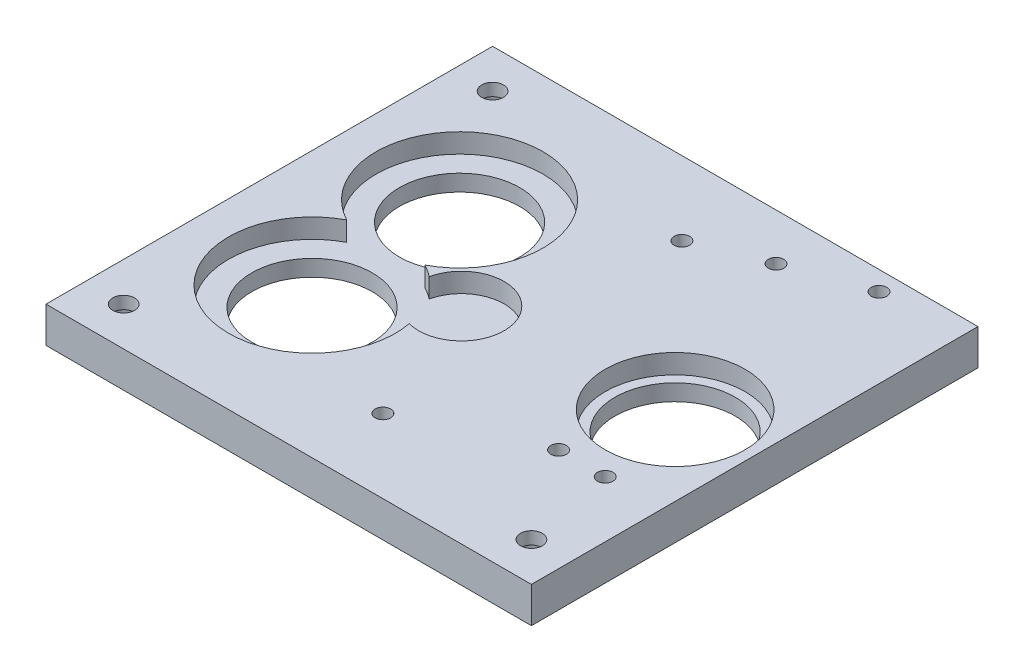
ISO-10303-21;
HEADER;
FILE_DESCRIPTION(('STEP AP214'),'2;1');
FILE_NAME('part.step','',(''),(''),'','','');
FILE_SCHEMA(('AUTOMOTIVE_DESIGN { 1 0 10303 214 1 1 1 1 }'));
ENDSEC;
DATA;
#1=APPLICATION_CONTEXT('core data for automotive mechanical design processes');
#2=APPLICATION_PROTOCOL_DEFINITION('international standard','automotive_design',2000,#1);
#3=PRODUCT_CONTEXT('',#1,'mechanical');
#4=PRODUCT('Part','Part','',(#3));
#5=PRODUCT_RELATED_PRODUCT_CATEGORY('part','',(#4));
#6=PRODUCT_DEFINITION_FORMATION('','',#4);
#7=PRODUCT_DEFINITION_CONTEXT('part definition',#1,'design');
#8=PRODUCT_DEFINITION('design','',#6,#7);
#9=PRODUCT_DEFINITION_SHAPE('','',#8);
#10=(LENGTH_UNIT() NAMED_UNIT(*) SI_UNIT(.MILLI.,.METRE.));
#11=(NAMED_UNIT(*) PLANE_ANGLE_UNIT() SI_UNIT($,.RADIAN.));
#12=(NAMED_UNIT(*) SI_UNIT($,.STERADIAN.) SOLID_ANGLE_UNIT());
#13=UNCERTAINTY_MEASURE_WITH_UNIT(LENGTH_MEASURE(1.E-05),#10,'distance_accuracy_value','');
#14=(GEOMETRIC_REPRESENTATION_CONTEXT(3) GLOBAL_UNCERTAINTY_ASSIGNED_CONTEXT((#13)) GLOBAL_UNIT_ASSIGNED_CONTEXT((#10,
#11,#12)) REPRESENTATION_CONTEXT('',''));
#15=CARTESIAN_POINT('',(0.,0.,0.));
#16=DIRECTION('',(0.,0.,1.));
#17=DIRECTION('',(1.,0.,0.));
#18=AXIS2_PLACEMENT_3D('',#15,#16,#17);
#19=CARTESIAN_POINT('',(52.5,0.,47.5));
#20=DIRECTION('',(0.,1.,0.));
#21=DIRECTION('',(0.,0.,1.));
#22=AXIS2_PLACEMENT_3D('',#19,#20,#21);
#23=CYLINDRICAL_SURFACE('',#22,2.8);
#24=CARTESIAN_POINT('',(52.5,9.215,47.5));
#25=DIRECTION('',(0.,1.,0.));
#26=DIRECTION('',(0.,0.,1.));
#27=AXIS2_PLACEMENT_3D('',#24,#25,#26);
#28=CIRCLE('',#27,2.8);
#29=CARTESIAN_POINT('',(52.5,9.215,50.3));
#30=VERTEX_POINT('',#29);
#31=EDGE_CURVE('E190',#30,#30,#28,.T.);
#32=ORIENTED_EDGE('',*,*,#31,.T.);
#33=EDGE_LOOP('',(#32));
#34=FACE_BOUND('',#33,.T.);
#35=CARTESIAN_POINT('',(52.5,6.,47.5));
#36=DIRECTION('',(0.,-1.,0.));
#37=DIRECTION('',(0.,0.,-1.));
#38=AXIS2_PLACEMENT_3D('',#35,#36,#37);
#39=CIRCLE('',#38,2.8);
#40=CARTESIAN_POINT('',(52.5,6.,44.7));
#41=VERTEX_POINT('',#40);
#42=EDGE_CURVE('E39',#41,#41,#39,.F.);
#43=ORIENTED_EDGE('',*,*,#42,.F.);
#44=EDGE_LOOP('',(#43));
#45=FACE_BOUND('',#44,.T.);
#46=ADVANCED_FACE('F35',(#34,#45),#23,.F.);
#47=CARTESIAN_POINT('',(-52.5,0.,47.5));
#48=DIRECTION('',(0.,1.,0.));
#49=DIRECTION('',(0.,0.,1.));
#50=AXIS2_PLACEMENT_3D('',#47,#48,#49);
#51=CYLINDRICAL_SURFACE('',#50,2.8);
#52=CARTESIAN_POINT('',(-52.5,9.215,47.5));
#53=DIRECTION('',(0.,1.,0.));
#54=DIRECTION('',(0.,0.,-1.));
#55=AXIS2_PLACEMENT_3D('',#52,#53,#54);
#56=CIRCLE('',#55,2.8);
#57=CARTESIAN_POINT('',(-52.5,9.215,44.7));
#58=VERTEX_POINT('',#57);
#59=EDGE_CURVE('E240',#58,#58,#56,.T.);
#60=ORIENTED_EDGE('',*,*,#59,.T.);
#61=EDGE_LOOP('',(#60));
#62=FACE_BOUND('',#61,.T.);
#63=CARTESIAN_POINT('',(-52.5,6.,47.5));
#64=DIRECTION('',(0.,-1.,0.));
#65=DIRECTION('',(0.,0.,-1.));
#66=AXIS2_PLACEMENT_3D('',#63,#64,#65);
#67=CIRCLE('',#66,2.8);
#68=CARTESIAN_POINT('',(-52.5,6.,44.7));
#69=VERTEX_POINT('',#68);
#70=EDGE_CURVE('E193',#69,#69,#67,.F.);
#71=ORIENTED_EDGE('',*,*,#70,.F.);
#72=EDGE_LOOP('',(#71));
#73=FACE_BOUND('',#72,.T.);
#74=ADVANCED_FACE('F316',(#62,#73),#51,.F.);
#75=CARTESIAN_POINT('',(-52.5,0.,-47.5));
#76=DIRECTION('',(0.,1.,0.));
#77=DIRECTION('',(0.,0.,1.));
#78=AXIS2_PLACEMENT_3D('',#75,#76,#77);
#79=CYLINDRICAL_SURFACE('',#78,2.8);
#80=CARTESIAN_POINT('',(-52.5,9.215,-47.5));
#81=DIRECTION('',(0.,1.,0.));
#82=DIRECTION('',(0.,0.,1.));
#83=AXIS2_PLACEMENT_3D('',#80,#81,#82);
#84=CIRCLE('',#83,2.8);
#85=CARTESIAN_POINT('',(-52.5,9.215,-44.7));
#86=VERTEX_POINT('',#85);
#87=EDGE_CURVE('E236',#86,#86,#84,.T.);
#88=ORIENTED_EDGE('',*,*,#87,.T.);
#89=EDGE_LOOP('',(#88));
#90=FACE_BOUND('',#89,.T.);
#91=CARTESIAN_POINT('',(-52.5,6.,-47.5));
#92=DIRECTION('',(0.,-1.,0.));
#93=DIRECTION('',(0.,0.,-1.));
#94=AXIS2_PLACEMENT_3D('',#91,#92,#93);
#95=CIRCLE('',#94,2.8);
#96=CARTESIAN_POINT('',(-52.5,6.,-50.3));
#97=VERTEX_POINT('',#96);
#98=EDGE_CURVE('E191',#97,#97,#95,.F.);
#99=ORIENTED_EDGE('',*,*,#98,.F.);
#100=EDGE_LOOP('',(#99));
#101=FACE_BOUND('',#100,.T.);
#102=ADVANCED_FACE('F322',(#90,#101),#79,.F.);
#103=CARTESIAN_POINT('',(36.,0.,24.));
#104=DIRECTION('',(0.,1.,0.));
#105=DIRECTION('',(0.,0.,1.));
#106=AXIS2_PLACEMENT_3D('',#103,#104,#105);
#107=CYLINDRICAL_SURFACE('',#106,2.);
#108=CARTESIAN_POINT('',(36.,9.215,24.));
#109=DIRECTION('',(0.,1.,0.));
#110=DIRECTION('',(0.,0.,-1.));
#111=AXIS2_PLACEMENT_3D('',#108,#109,#110);
#112=CIRCLE('',#111,2.);
#113=CARTESIAN_POINT('',(36.,9.215,22.));
#114=VERTEX_POINT('',#113);
#115=EDGE_CURVE('E248',#114,#114,#112,.T.);
#116=ORIENTED_EDGE('',*,*,#115,.T.);
#117=EDGE_LOOP('',(#116));
#118=FACE_BOUND('',#117,.T.);
#119=CARTESIAN_POINT('',(36.,4.,24.));
#120=DIRECTION('',(0.,-1.,0.));
#121=DIRECTION('',(0.,0.,-1.));
#122=AXIS2_PLACEMENT_3D('',#119,#120,#121);
#123=CIRCLE('',#122,2.);
#124=CARTESIAN_POINT('',(36.,4.,22.));
#125=VERTEX_POINT('',#124);
#126=EDGE_CURVE('E187',#125,#125,#123,.F.);
#127=ORIENTED_EDGE('',*,*,#126,.F.);
#128=EDGE_LOOP('',(#127));
#129=FACE_BOUND('',#128,.T.);
#130=ADVANCED_FACE('F347',(#118,#129),#107,.F.);
#131=CARTESIAN_POINT('',(48.,0.,24.));
#132=DIRECTION('',(0.,1.,0.));
#133=DIRECTION('',(0.,0.,1.));
#134=AXIS2_PLACEMENT_3D('',#131,#132,#133);
#135=CYLINDRICAL_SURFACE('',#134,2.);
#136=CARTESIAN_POINT('',(48.,9.215,24.));
#137=DIRECTION('',(0.,1.,0.));
#138=DIRECTION('',(0.,0.,1.));
#139=AXIS2_PLACEMENT_3D('',#136,#137,#138);
#140=CIRCLE('',#139,2.);
#141=CARTESIAN_POINT('',(48.,9.215,26.));
#142=VERTEX_POINT('',#141);
#143=EDGE_CURVE('E258',#142,#142,#140,.T.);
#144=ORIENTED_EDGE('',*,*,#143,.T.);
#145=EDGE_LOOP('',(#144));
#146=FACE_BOUND('',#145,.T.);
#147=CARTESIAN_POINT('',(48.,4.,24.));
#148=DIRECTION('',(0.,-1.,0.));
#149=DIRECTION('',(0.,0.,-1.));
#150=AXIS2_PLACEMENT_3D('',#147,#148,#149);
#151=CIRCLE('',#150,2.);
#152=CARTESIAN_POINT('',(48.,4.,22.));
#153=VERTEX_POINT('',#152);
#154=EDGE_CURVE('E184',#153,#153,#151,.F.);
#155=ORIENTED_EDGE('',*,*,#154,.F.);
#156=EDGE_LOOP('',(#155));
#157=FACE_BOUND('',#156,.T.);
#158=ADVANCED_FACE('F343',(#146,#157),#135,.F.);
#159=CARTESIAN_POINT('',(42.,0.,-52.5));
#160=DIRECTION('',(0.,1.,0.));
#161=DIRECTION('',(0.,0.,1.));
#162=AXIS2_PLACEMENT_3D('',#159,#160,#161);
#163=CYLINDRICAL_SURFACE('',#162,2.);
#164=CARTESIAN_POINT('',(42.,9.215,-52.5));
#165=DIRECTION('',(0.,1.,0.));
#166=DIRECTION('',(0.,0.,1.));
#167=AXIS2_PLACEMENT_3D('',#164,#165,#166);
#168=CIRCLE('',#167,2.);
#169=CARTESIAN_POINT('',(42.,9.215,-50.5));
#170=VERTEX_POINT('',#169);
#171=EDGE_CURVE('E255',#170,#170,#168,.T.);
#172=ORIENTED_EDGE('',*,*,#171,.T.);
#173=EDGE_LOOP('',(#172));
#174=FACE_BOUND('',#173,.T.);
#175=CARTESIAN_POINT('',(42.,4.,-52.5));
#176=DIRECTION('',(0.,-1.,0.));
#177=DIRECTION('',(0.,0.,-1.));
#178=AXIS2_PLACEMENT_3D('',#175,#176,#177);
#179=CIRCLE('',#178,2.);
#180=CARTESIAN_POINT('',(42.,4.,-54.5));
#181=VERTEX_POINT('',#180);
#182=EDGE_CURVE('E181',#181,#181,#179,.F.);
#183=ORIENTED_EDGE('',*,*,#182,.F.);
#184=EDGE_LOOP('',(#183));
#185=FACE_BOUND('',#184,.T.);
#186=ADVANCED_FACE('F339',(#174,#185),#163,.F.);
#187=CARTESIAN_POINT('',(22.5,0.,-45.5));
#188=DIRECTION('',(0.,1.,0.));
#189=DIRECTION('',(0.,0.,1.));
#190=AXIS2_PLACEMENT_3D('',#187,#188,#189);
#191=CYLINDRICAL_SURFACE('',#190,2.);
#192=CARTESIAN_POINT('',(22.5,9.215,-45.5));
#193=DIRECTION('',(0.,1.,0.));
#194=DIRECTION('',(0.,0.,1.));
#195=AXIS2_PLACEMENT_3D('',#192,#193,#194);
#196=CIRCLE('',#195,2.);
#197=CARTESIAN_POINT('',(22.5,9.215,-43.5));
#198=VERTEX_POINT('',#197);
#199=EDGE_CURVE('E251',#198,#198,#196,.T.);
#200=ORIENTED_EDGE('',*,*,#199,.T.);
#201=EDGE_LOOP('',(#200));
#202=FACE_BOUND('',#201,.T.);
#203=CARTESIAN_POINT('',(22.5,4.,-45.5));
#204=DIRECTION('',(0.,-1.,0.));
#205=DIRECTION('',(0.,0.,-1.));
#206=AXIS2_PLACEMENT_3D('',#203,#204,#205);
#207=CIRCLE('',#206,2.);
#208=CARTESIAN_POINT('',(22.5,4.,-47.5));
#209=VERTEX_POINT('',#208);
#210=EDGE_CURVE('E178',#209,#209,#207,.F.);
#211=ORIENTED_EDGE('',*,*,#210,.F.);
#212=EDGE_LOOP('',(#211));
#213=FACE_BOUND('',#212,.T.);
#214=ADVANCED_FACE('F335',(#202,#213),#191,.F.);
#215=CARTESIAN_POINT('',(5.25000000000001,0.,38.5));
#216=DIRECTION('',(0.,1.,0.));
#217=DIRECTION('',(0.,0.,1.));
#218=AXIS2_PLACEMENT_3D('',#215,#216,#217);
#219=CYLINDRICAL_SURFACE('',#218,2.);
#220=CARTESIAN_POINT('',(5.25000000000001,9.215,38.5));
#221=DIRECTION('',(0.,1.,0.));
#222=DIRECTION('',(0.,0.,-1.));
#223=AXIS2_PLACEMENT_3D('',#220,#221,#222);
#224=CIRCLE('',#223,2.);
#225=CARTESIAN_POINT('',(5.25000000000001,9.215,36.5));
#226=VERTEX_POINT('',#225);
#227=EDGE_CURVE('E239',#226,#226,#224,.T.);
#228=ORIENTED_EDGE('',*,*,#227,.T.);
#229=EDGE_LOOP('',(#228));
#230=FACE_BOUND('',#229,.T.);
#231=CARTESIAN_POINT('',(5.25000000000001,4.,38.5));
#232=DIRECTION('',(0.,-1.,0.));
#233=DIRECTION('',(0.,0.,-1.));
#234=AXIS2_PLACEMENT_3D('',#231,#232,#233);
#235=CIRCLE('',#234,2.);
#236=CARTESIAN_POINT('',(5.25000000000001,4.,36.5));
#237=VERTEX_POINT('',#236);
#238=EDGE_CURVE('E174',#237,#237,#235,.F.);
#239=ORIENTED_EDGE('',*,*,#238,.F.);
#240=EDGE_LOOP('',(#239));
#241=FACE_BOUND('',#240,.T.);
#242=ADVANCED_FACE('F331',(#230,#241),#219,.F.);
#243=CARTESIAN_POINT('',(5.25000000000001,0.,-38.5));
#244=DIRECTION('',(0.,1.,0.));
#245=DIRECTION('',(0.,0.,1.));
#246=AXIS2_PLACEMENT_3D('',#243,#244,#245);
#247=CYLINDRICAL_SURFACE('',#246,2.);
#248=CARTESIAN_POINT('',(5.25000000000001,9.215,-38.5));
#249=DIRECTION('',(0.,1.,0.));
#250=DIRECTION('',(0.,0.,1.));
#251=AXIS2_PLACEMENT_3D('',#248,#249,#250);
#252=CIRCLE('',#251,2.);
#253=CARTESIAN_POINT('',(5.25000000000001,9.215,-36.5));
#254=VERTEX_POINT('',#253);
#255=EDGE_CURVE('E245',#254,#254,#252,.T.);
#256=ORIENTED_EDGE('',*,*,#255,.T.);
#257=EDGE_LOOP('',(#256));
#258=FACE_BOUND('',#257,.T.);
#259=CARTESIAN_POINT('',(5.25000000000001,4.,-38.5));
#260=DIRECTION('',(0.,-1.,0.));
#261=DIRECTION('',(0.,0.,-1.));
#262=AXIS2_PLACEMENT_3D('',#259,#260,#261);
#263=CIRCLE('',#262,2.);
#264=CARTESIAN_POINT('',(5.25000000000001,4.,-40.5));
#265=VERTEX_POINT('',#264);
#266=EDGE_CURVE('E171',#265,#265,#263,.F.);
#267=ORIENTED_EDGE('',*,*,#266,.F.);
#268=EDGE_LOOP('',(#267));
#269=FACE_BOUND('',#268,.T.);
#270=ADVANCED_FACE('F328',(#258,#269),#247,.F.);
#271=CARTESIAN_POINT('',(-32.5,4.215,19.));
#272=DIRECTION('',(0.,1.,0.));
#273=DIRECTION('',(0.,0.,1.));
#274=AXIS2_PLACEMENT_3D('',#271,#272,#273);
#275=CYLINDRICAL_SURFACE('',#274,21.5);
#276=CARTESIAN_POINT('',(-32.5,4.215,19.));
#277=DIRECTION('',(0.,1.,0.));
#278=DIRECTION('',(0.,0.,1.));
#279=AXIS2_PLACEMENT_3D('',#276,#277,#278);
#280=CIRCLE('',#279,21.5);
#281=CARTESIAN_POINT('',(-19.305968133523,4.215,2.02450227220451));
#282=VERTEX_POINT('',#281);
#283=CARTESIAN_POINT('',(-22.4376941012509,4.215,0.));
#284=VERTEX_POINT('',#283);
#285=EDGE_CURVE('E123',#282,#284,#280,.T.);
#286=ORIENTED_EDGE('',*,*,#285,.F.);
#287=DIRECTION('',(0.,1.,0.));
#288=VECTOR('',#287,1.);
#289=CARTESIAN_POINT('',(-19.305968133523,6.715,2.02450227220451));
#290=LINE('',#289,#288);
#291=CARTESIAN_POINT('',(-19.305968133523,9.215,2.02450227220451));
#292=VERTEX_POINT('',#291);
#293=EDGE_CURVE('E106',#282,#292,#290,.T.);
#294=ORIENTED_EDGE('',*,*,#293,.T.);
#295=CARTESIAN_POINT('',(-32.5,9.215,19.));
#296=DIRECTION('',(0.,1.,0.));
#297=DIRECTION('',(0.,0.,1.));
#298=AXIS2_PLACEMENT_3D('',#295,#296,#297);
#299=CIRCLE('',#298,21.5);
#300=CARTESIAN_POINT('',(-22.4376941012509,9.215,0.));
#301=VERTEX_POINT('',#300);
#302=EDGE_CURVE('E131',#292,#301,#299,.T.);
#303=ORIENTED_EDGE('',*,*,#302,.T.);
#304=DIRECTION('',(0.,1.,0.));
#305=VECTOR('',#304,1.);
#306=CARTESIAN_POINT('',(-22.4376941012509,4.215,0.));
#307=LINE('',#306,#305);
#308=EDGE_CURVE('E125',#284,#301,#307,.T.);
#309=ORIENTED_EDGE('',*,*,#308,.F.);
#310=EDGE_LOOP('',(#286,#294,#303,#309));
#311=FACE_BOUND('',#310,.T.);
#312=ADVANCED_FACE('F277',(#311),#275,.F.);
#313=CARTESIAN_POINT('',(62.5,9.215,57.5));
#314=DIRECTION('',(-1.,0.,0.));
#315=DIRECTION('',(0.,0.,1.));
#316=AXIS2_PLACEMENT_3D('',#313,#314,#315);
#317=PLANE('',#316);
#318=DIRECTION('',(0.,0.,-1.));
#319=VECTOR('',#318,1.);
#320=CARTESIAN_POINT('',(62.5,0.,57.5));
#321=LINE('',#320,#319);
#322=CARTESIAN_POINT('',(62.5,0.,57.5));
#323=VERTEX_POINT('',#322);
#324=CARTESIAN_POINT('',(62.5,0.,-57.5));
#325=VERTEX_POINT('',#324);
#326=EDGE_CURVE('E133',#323,#325,#321,.T.);
#327=ORIENTED_EDGE('',*,*,#326,.T.);
#328=DIRECTION('',(0.,-1.,0.));
#329=VECTOR('',#328,1.);
#330=CARTESIAN_POINT('',(62.5,9.215,-57.5));
#331=LINE('',#330,#329);
#332=CARTESIAN_POINT('',(62.5,9.215,-57.5));
#333=VERTEX_POINT('',#332);
#334=EDGE_CURVE('E11',#333,#325,#331,.T.);
#335=ORIENTED_EDGE('',*,*,#334,.F.);
#336=DIRECTION('',(0.,0.,-1.));
#337=VECTOR('',#336,1.);
#338=CARTESIAN_POINT('',(62.5,9.215,57.5));
#339=LINE('',#338,#337);
#340=CARTESIAN_POINT('',(62.5,9.215,57.5));
#341=VERTEX_POINT('',#340);
#342=EDGE_CURVE('E135',#341,#333,#339,.T.);
#343=ORIENTED_EDGE('',*,*,#342,.F.);
#344=DIRECTION('',(0.,-1.,0.));
#345=VECTOR('',#344,1.);
#346=CARTESIAN_POINT('',(62.5,9.215,57.5));
#347=LINE('',#346,#345);
#348=EDGE_CURVE('E145',#341,#323,#347,.T.);
#349=ORIENTED_EDGE('',*,*,#348,.T.);
#350=EDGE_LOOP('',(#327,#335,#343,#349));
#351=FACE_BOUND('',#350,.T.);
#352=ADVANCED_FACE('F37',(#351),#317,.F.);
#353=CARTESIAN_POINT('',(-62.5,9.215,-57.5));
#354=DIRECTION('',(0.,0.,1.));
#355=DIRECTION('',(1.,0.,0.));
#356=AXIS2_PLACEMENT_3D('',#353,#354,#355);
#357=PLANE('',#356);
#358=DIRECTION('',(-1.,0.,0.));
#359=VECTOR('',#358,1.);
#360=CARTESIAN_POINT('',(-62.5,0.,-57.5));
#361=LINE('',#360,#359);
#362=CARTESIAN_POINT('',(-62.5,0.,-57.5));
#363=VERTEX_POINT('',#362);
#364=EDGE_CURVE('E148',#325,#363,#361,.T.);
#365=ORIENTED_EDGE('',*,*,#364,.T.);
#366=DIRECTION('',(0.,-1.,0.));
#367=VECTOR('',#366,1.);
#368=CARTESIAN_POINT('',(-62.5,9.215,-57.5));
#369=LINE('',#368,#367);
#370=CARTESIAN_POINT('',(-62.5,9.215,-57.5));
#371=VERTEX_POINT('',#370);
#372=EDGE_CURVE('E44',#371,#363,#369,.T.);
#373=ORIENTED_EDGE('',*,*,#372,.F.);
#374=DIRECTION('',(-1.,0.,0.));
#375=VECTOR('',#374,1.);
#376=CARTESIAN_POINT('',(-62.5,9.215,-57.5));
#377=LINE('',#376,#375);
#378=EDGE_CURVE('E138',#333,#371,#377,.T.);
#379=ORIENTED_EDGE('',*,*,#378,.F.);
#380=ORIENTED_EDGE('',*,*,#334,.T.);
#381=EDGE_LOOP('',(#365,#373,#379,#380));
#382=FACE_BOUND('',#381,.T.);
#383=ADVANCED_FACE('F295',(#382),#357,.F.);
#384=CARTESIAN_POINT('',(-62.5,9.215,57.5));
#385=DIRECTION('',(1.,0.,0.));
#386=DIRECTION('',(0.,0.,-1.));
#387=AXIS2_PLACEMENT_3D('',#384,#385,#386);
#388=PLANE('',#387);
#389=DIRECTION('',(0.,0.,1.));
#390=VECTOR('',#389,1.);
#391=CARTESIAN_POINT('',(-62.5,0.,57.5));
#392=LINE('',#391,#390);
#393=CARTESIAN_POINT('',(-62.5,0.,57.5));
#394=VERTEX_POINT('',#393);
#395=EDGE_CURVE('E150',#363,#394,#392,.T.);
#396=ORIENTED_EDGE('',*,*,#395,.T.);
#397=DIRECTION('',(0.,-1.,0.));
#398=VECTOR('',#397,1.);
#399=CARTESIAN_POINT('',(-62.5,9.215,57.5));
#400=LINE('',#399,#398);
#401=CARTESIAN_POINT('',(-62.5,9.215,57.5));
#402=VERTEX_POINT('',#401);
#403=EDGE_CURVE('E155',#402,#394,#400,.T.);
#404=ORIENTED_EDGE('',*,*,#403,.F.);
#405=DIRECTION('',(0.,0.,1.));
#406=VECTOR('',#405,1.);
#407=CARTESIAN_POINT('',(-62.5,9.215,57.5));
#408=LINE('',#407,#406);
#409=EDGE_CURVE('E141',#371,#402,#408,.T.);
#410=ORIENTED_EDGE('',*,*,#409,.F.);
#411=ORIENTED_EDGE('',*,*,#372,.T.);
#412=EDGE_LOOP('',(#396,#404,#410,#411));
#413=FACE_BOUND('',#412,.T.);
#414=ADVANCED_FACE('F300',(#413),#388,.F.);
#415=CARTESIAN_POINT('',(-62.5,9.215,57.5));
#416=DIRECTION('',(0.,0.,-1.));
#417=DIRECTION('',(-1.,0.,0.));
#418=AXIS2_PLACEMENT_3D('',#415,#416,#417);
#419=PLANE('',#418);
#420=DIRECTION('',(1.,0.,0.));
#421=VECTOR('',#420,1.);
#422=CARTESIAN_POINT('',(-62.5,0.,57.5));
#423=LINE('',#422,#421);
#424=EDGE_CURVE('E139',#394,#323,#423,.T.);
#425=ORIENTED_EDGE('',*,*,#424,.T.);
#426=ORIENTED_EDGE('',*,*,#348,.F.);
#427=DIRECTION('',(1.,0.,0.));
#428=VECTOR('',#427,1.);
#429=CARTESIAN_POINT('',(-62.5,9.215,57.5));
#430=LINE('',#429,#428);
#431=EDGE_CURVE('E143',#402,#341,#430,.T.);
#432=ORIENTED_EDGE('',*,*,#431,.F.);
#433=ORIENTED_EDGE('',*,*,#403,.T.);
#434=EDGE_LOOP('',(#425,#426,#432,#433));
#435=FACE_BOUND('',#434,.T.);
#436=ADVANCED_FACE('F284',(#435),#419,.F.);
#437=CARTESIAN_POINT('',(0.,9.215,0.));
#438=DIRECTION('',(0.,-1.,0.));
#439=DIRECTION('',(0.,0.,-1.));
#440=AXIS2_PLACEMENT_3D('',#437,#438,#439);
#441=PLANE('',#440);
#442=ORIENTED_EDGE('',*,*,#87,.F.);
#443=EDGE_LOOP('',(#442));
#444=FACE_BOUND('',#443,.T.);
#445=ORIENTED_EDGE('',*,*,#59,.F.);
#446=EDGE_LOOP('',(#445));
#447=FACE_BOUND('',#446,.T.);
#448=ORIENTED_EDGE('',*,*,#31,.F.);
#449=EDGE_LOOP('',(#448));
#450=FACE_BOUND('',#449,.T.);
#451=ORIENTED_EDGE('',*,*,#255,.F.);
#452=EDGE_LOOP('',(#451));
#453=FACE_BOUND('',#452,.T.);
#454=ORIENTED_EDGE('',*,*,#227,.F.);
#455=EDGE_LOOP('',(#454));
#456=FACE_BOUND('',#455,.T.);
#457=ORIENTED_EDGE('',*,*,#199,.F.);
#458=EDGE_LOOP('',(#457));
#459=FACE_BOUND('',#458,.T.);
#460=ORIENTED_EDGE('',*,*,#171,.F.);
#461=EDGE_LOOP('',(#460));
#462=FACE_BOUND('',#461,.T.);
#463=ORIENTED_EDGE('',*,*,#143,.F.);
#464=EDGE_LOOP('',(#463));
#465=FACE_BOUND('',#464,.T.);
#466=ORIENTED_EDGE('',*,*,#115,.F.);
#467=EDGE_LOOP('',(#466));
#468=FACE_BOUND('',#467,.T.);
#469=CARTESIAN_POINT('',(42.,9.215,0.));
#470=DIRECTION('',(0.,1.,0.));
#471=DIRECTION('',(0.,0.,1.));
#472=AXIS2_PLACEMENT_3D('',#469,#470,#471);
#473=CIRCLE('',#472,18.);
#474=CARTESIAN_POINT('',(42.,9.215,18.));
#475=VERTEX_POINT('',#474);
#476=EDGE_CURVE('E170',#475,#475,#473,.T.);
#477=ORIENTED_EDGE('',*,*,#476,.F.);
#478=EDGE_LOOP('',(#477));
#479=FACE_BOUND('',#478,.T.);
#480=ORIENTED_EDGE('',*,*,#302,.F.);
#481=CARTESIAN_POINT('',(-8.57685964794719,9.215,4.45065789473684));
#482=DIRECTION('',(0.,1.,0.));
#483=DIRECTION('',(0.,0.,1.));
#484=AXIS2_PLACEMENT_3D('',#481,#482,#483);
#485=CIRCLE('',#484,11.);
#486=CARTESIAN_POINT('',(-11.3579174772583,9.215,15.0932946615361));
#487=VERTEX_POINT('',#486);
#488=EDGE_CURVE('E108',#487,#292,#485,.T.);
#489=ORIENTED_EDGE('',*,*,#488,.F.);
#490=CARTESIAN_POINT('',(-42.562305898749,9.215,0.));
#491=VERTEX_POINT('',#490);
#492=EDGE_CURVE('E116',#491,#487,#299,.T.);
#493=ORIENTED_EDGE('',*,*,#492,.F.);
#494=CARTESIAN_POINT('',(-32.5,9.215,-19.));
#495=DIRECTION('',(0.,1.,0.));
#496=DIRECTION('',(0.,0.,1.));
#497=AXIS2_PLACEMENT_3D('',#494,#495,#496);
#498=CIRCLE('',#497,21.5);
#499=EDGE_CURVE('E60',#301,#491,#498,.T.);
#500=ORIENTED_EDGE('',*,*,#499,.F.);
#501=EDGE_LOOP('',(#480,#489,#493,#500));
#502=FACE_BOUND('',#501,.T.);
#503=ORIENTED_EDGE('',*,*,#342,.T.);
#504=ORIENTED_EDGE('',*,*,#378,.T.);
#505=ORIENTED_EDGE('',*,*,#409,.T.);
#506=ORIENTED_EDGE('',*,*,#431,.T.);
#507=EDGE_LOOP('',(#503,#504,#505,#506));
#508=FACE_BOUND('',#507,.T.);
#509=ADVANCED_FACE('F280',(#444,#447,#450,#453,#456,#459,#462,#465,#468,#479,#502,#508),#441,.F.);
#510=CARTESIAN_POINT('',(0.,0.,0.));
#511=DIRECTION('',(0.,-1.,0.));
#512=DIRECTION('',(0.,0.,-1.));
#513=AXIS2_PLACEMENT_3D('',#510,#511,#512);
#514=PLANE('',#513);
#515=CARTESIAN_POINT('',(-52.5,0.,-47.5));
#516=DIRECTION('',(0.,-1.,0.));
#517=DIRECTION('',(0.,0.,-1.));
#518=AXIS2_PLACEMENT_3D('',#515,#516,#517);
#519=CIRCLE('',#518,5.25);
#520=CARTESIAN_POINT('',(-52.5,0.,-52.75));
#521=VERTEX_POINT('',#520);
#522=EDGE_CURVE('E660',#521,#521,#519,.T.);
#523=ORIENTED_EDGE('',*,*,#522,.F.);
#524=EDGE_LOOP('',(#523));
#525=FACE_BOUND('',#524,.T.);
#526=CARTESIAN_POINT('',(52.5,0.,47.5));
#527=DIRECTION('',(0.,-1.,0.));
#528=DIRECTION('',(0.,0.,-1.));
#529=AXIS2_PLACEMENT_3D('',#526,#527,#528);
#530=CIRCLE('',#529,5.25);
#531=CARTESIAN_POINT('',(52.5,0.,42.25));
#532=VERTEX_POINT('',#531);
#533=EDGE_CURVE('E654',#532,#532,#530,.T.);
#534=ORIENTED_EDGE('',*,*,#533,.F.);
#535=EDGE_LOOP('',(#534));
#536=FACE_BOUND('',#535,.T.);
#537=CARTESIAN_POINT('',(-52.5,0.,47.5));
#538=DIRECTION('',(0.,-1.,0.));
#539=DIRECTION('',(0.,0.,-1.));
#540=AXIS2_PLACEMENT_3D('',#537,#538,#539);
#541=CIRCLE('',#540,5.25);
#542=CARTESIAN_POINT('',(-52.5,0.,42.25));
#543=VERTEX_POINT('',#542);
#544=EDGE_CURVE('E657',#543,#543,#541,.T.);
#545=ORIENTED_EDGE('',*,*,#544,.F.);
#546=EDGE_LOOP('',(#545));
#547=FACE_BOUND('',#546,.T.);
#548=CARTESIAN_POINT('',(5.25000000000001,0.,38.5));
#549=DIRECTION('',(0.,-1.,0.));
#550=DIRECTION('',(0.,0.,-1.));
#551=AXIS2_PLACEMENT_3D('',#548,#549,#550);
#552=CIRCLE('',#551,3.75);
#553=CARTESIAN_POINT('',(5.25000000000001,0.,34.75));
#554=VERTEX_POINT('',#553);
#555=EDGE_CURVE('E215',#554,#554,#552,.T.);
#556=ORIENTED_EDGE('',*,*,#555,.F.);
#557=EDGE_LOOP('',(#556));
#558=FACE_BOUND('',#557,.T.);
#559=CARTESIAN_POINT('',(48.,0.,24.));
#560=DIRECTION('',(0.,-1.,0.));
#561=DIRECTION('',(0.,0.,-1.));
#562=AXIS2_PLACEMENT_3D('',#559,#560,#561);
#563=CIRCLE('',#562,3.75);
#564=CARTESIAN_POINT('',(48.,0.,20.25));
#565=VERTEX_POINT('',#564);
#566=EDGE_CURVE('E199',#565,#565,#563,.T.);
#567=ORIENTED_EDGE('',*,*,#566,.F.);
#568=EDGE_LOOP('',(#567));
#569=FACE_BOUND('',#568,.T.);
#570=CARTESIAN_POINT('',(36.,0.,24.));
#571=DIRECTION('',(0.,-1.,0.));
#572=DIRECTION('',(0.,0.,-1.));
#573=AXIS2_PLACEMENT_3D('',#570,#571,#572);
#574=CIRCLE('',#573,3.75);
#575=CARTESIAN_POINT('',(36.,0.,20.25));
#576=VERTEX_POINT('',#575);
#577=EDGE_CURVE('E208',#576,#576,#574,.T.);
#578=ORIENTED_EDGE('',*,*,#577,.F.);
#579=EDGE_LOOP('',(#578));
#580=FACE_BOUND('',#579,.T.);
#581=CARTESIAN_POINT('',(42.,0.,-52.5));
#582=DIRECTION('',(0.,-1.,0.));
#583=DIRECTION('',(0.,0.,-1.));
#584=AXIS2_PLACEMENT_3D('',#581,#582,#583);
#585=CIRCLE('',#584,3.75000000000001);
#586=CARTESIAN_POINT('',(42.,0.,-56.25));
#587=VERTEX_POINT('',#586);
#588=EDGE_CURVE('E228',#587,#587,#585,.T.);
#589=ORIENTED_EDGE('',*,*,#588,.F.);
#590=EDGE_LOOP('',(#589));
#591=FACE_BOUND('',#590,.T.);
#592=CARTESIAN_POINT('',(22.5,0.,-45.5));
#593=DIRECTION('',(0.,-1.,0.));
#594=DIRECTION('',(0.,0.,-1.));
#595=AXIS2_PLACEMENT_3D('',#592,#593,#594);
#596=CIRCLE('',#595,3.75);
#597=CARTESIAN_POINT('',(22.5,0.,-49.25));
#598=VERTEX_POINT('',#597);
#599=EDGE_CURVE('E222',#598,#598,#596,.T.);
#600=ORIENTED_EDGE('',*,*,#599,.F.);
#601=EDGE_LOOP('',(#600));
#602=FACE_BOUND('',#601,.T.);
#603=CARTESIAN_POINT('',(5.25000000000001,0.,-38.5));
#604=DIRECTION('',(0.,-1.,0.));
#605=DIRECTION('',(0.,0.,-1.));
#606=AXIS2_PLACEMENT_3D('',#603,#604,#605);
#607=CIRCLE('',#606,3.75);
#608=CARTESIAN_POINT('',(5.25000000000001,0.,-42.25));
#609=VERTEX_POINT('',#608);
#610=EDGE_CURVE('E216',#609,#609,#607,.T.);
#611=ORIENTED_EDGE('',*,*,#610,.F.);
#612=EDGE_LOOP('',(#611));
#613=FACE_BOUND('',#612,.T.);
#614=CARTESIAN_POINT('',(42.,0.,0.));
#615=DIRECTION('',(0.,1.,0.));
#616=DIRECTION('',(0.,0.,1.));
#617=AXIS2_PLACEMENT_3D('',#614,#615,#616);
#618=CIRCLE('',#617,15.5);
#619=CARTESIAN_POINT('',(42.,0.,15.5));
#620=VERTEX_POINT('',#619);
#621=EDGE_CURVE('E254',#620,#620,#618,.T.);
#622=ORIENTED_EDGE('',*,*,#621,.T.);
#623=EDGE_LOOP('',(#622));
#624=FACE_BOUND('',#623,.T.);
#625=CARTESIAN_POINT('',(-32.5,0.,19.));
#626=DIRECTION('',(0.,1.,0.));
#627=DIRECTION('',(0.,0.,1.));
#628=AXIS2_PLACEMENT_3D('',#625,#626,#627);
#629=CIRCLE('',#628,15.5);
#630=CARTESIAN_POINT('',(-32.5,0.,34.5));
#631=VERTEX_POINT('',#630);
#632=EDGE_CURVE('E263',#631,#631,#629,.T.);
#633=ORIENTED_EDGE('',*,*,#632,.T.);
#634=EDGE_LOOP('',(#633));
#635=FACE_BOUND('',#634,.T.);
#636=CARTESIAN_POINT('',(-32.5,0.,-19.));
#637=DIRECTION('',(0.,1.,0.));
#638=DIRECTION('',(0.,0.,1.));
#639=AXIS2_PLACEMENT_3D('',#636,#637,#638);
#640=CIRCLE('',#639,15.5);
#641=CARTESIAN_POINT('',(-32.5,0.,-3.5));
#642=VERTEX_POINT('',#641);
#643=EDGE_CURVE('E164',#642,#642,#640,.T.);
#644=ORIENTED_EDGE('',*,*,#643,.T.);
#645=EDGE_LOOP('',(#644));
#646=FACE_BOUND('',#645,.T.);
#647=ORIENTED_EDGE('',*,*,#326,.F.);
#648=ORIENTED_EDGE('',*,*,#424,.F.);
#649=ORIENTED_EDGE('',*,*,#395,.F.);
#650=ORIENTED_EDGE('',*,*,#364,.F.);
#651=EDGE_LOOP('',(#647,#648,#649,#650));
#652=FACE_BOUND('',#651,.T.);
#653=ADVANCED_FACE('F283',(#525,#536,#547,#558,#569,#580,#591,#602,#613,#624,#635,#646,#652),
#514,.T.);
#654=CARTESIAN_POINT('',(-32.5,4.215,-19.));
#655=DIRECTION('',(0.,1.,0.));
#656=DIRECTION('',(0.,0.,1.));
#657=AXIS2_PLACEMENT_3D('',#654,#655,#656);
#658=CYLINDRICAL_SURFACE('',#657,21.5);
#659=ORIENTED_EDGE('',*,*,#499,.T.);
#660=DIRECTION('',(0.,1.,0.));
#661=VECTOR('',#660,1.);
#662=CARTESIAN_POINT('',(-42.562305898749,4.215,0.));
#663=LINE('',#662,#661);
#664=CARTESIAN_POINT('',(-42.562305898749,4.215,0.));
#665=VERTEX_POINT('',#664);
#666=EDGE_CURVE('E122',#665,#491,#663,.T.);
#667=ORIENTED_EDGE('',*,*,#666,.F.);
#668=CARTESIAN_POINT('',(-32.5,4.215,-19.));
#669=DIRECTION('',(0.,1.,0.));
#670=DIRECTION('',(0.,0.,1.));
#671=AXIS2_PLACEMENT_3D('',#668,#669,#670);
#672=CIRCLE('',#671,21.5);
#673=EDGE_CURVE('E121',#284,#665,#672,.T.);
#674=ORIENTED_EDGE('',*,*,#673,.F.);
#675=ORIENTED_EDGE('',*,*,#308,.T.);
#676=EDGE_LOOP('',(#659,#667,#674,#675));
#677=FACE_BOUND('',#676,.T.);
#678=ADVANCED_FACE('F305',(#677),#658,.F.);
#679=ORIENTED_EDGE('',*,*,#492,.T.);
#680=DIRECTION('',(0.,1.,0.));
#681=VECTOR('',#680,1.);
#682=CARTESIAN_POINT('',(-11.3579174772583,6.715,15.0932946615361));
#683=LINE('',#682,#681);
#684=CARTESIAN_POINT('',(-11.3579174772583,4.215,15.0932946615361));
#685=VERTEX_POINT('',#684);
#686=EDGE_CURVE('E103',#487,#685,#683,.F.);
#687=ORIENTED_EDGE('',*,*,#686,.T.);
#688=EDGE_CURVE('E114',#665,#685,#280,.T.);
#689=ORIENTED_EDGE('',*,*,#688,.F.);
#690=ORIENTED_EDGE('',*,*,#666,.T.);
#691=EDGE_LOOP('',(#679,#687,#689,#690));
#692=FACE_BOUND('',#691,.T.);
#693=ADVANCED_FACE('F113',(#692),#275,.F.);
#694=CARTESIAN_POINT('',(0.,4.215,0.));
#695=DIRECTION('',(0.,1.,0.));
#696=DIRECTION('',(0.,0.,1.));
#697=AXIS2_PLACEMENT_3D('',#694,#695,#696);
#698=PLANE('',#697);
#699=CARTESIAN_POINT('',(-32.5,4.215,19.));
#700=DIRECTION('',(0.,1.,0.));
#701=DIRECTION('',(0.,0.,1.));
#702=AXIS2_PLACEMENT_3D('',#699,#700,#701);
#703=CIRCLE('',#702,15.5);
#704=CARTESIAN_POINT('',(-32.5,4.215,34.5));
#705=VERTEX_POINT('',#704);
#706=EDGE_CURVE('E167',#705,#705,#703,.T.);
#707=ORIENTED_EDGE('',*,*,#706,.F.);
#708=EDGE_LOOP('',(#707));
#709=FACE_BOUND('',#708,.T.);
#710=CARTESIAN_POINT('',(-32.5,4.215,-19.));
#711=DIRECTION('',(0.,1.,0.));
#712=DIRECTION('',(0.,0.,1.));
#713=AXIS2_PLACEMENT_3D('',#710,#711,#712);
#714=CIRCLE('',#713,15.5);
#715=CARTESIAN_POINT('',(-32.5,4.215,-3.5));
#716=VERTEX_POINT('',#715);
#717=EDGE_CURVE('E163',#716,#716,#714,.T.);
#718=ORIENTED_EDGE('',*,*,#717,.F.);
#719=EDGE_LOOP('',(#718));
#720=FACE_BOUND('',#719,.T.);
#721=ORIENTED_EDGE('',*,*,#688,.T.);
#722=CARTESIAN_POINT('',(-8.57685964794719,4.215,4.45065789473684));
#723=DIRECTION('',(0.,1.,0.));
#724=DIRECTION('',(0.,0.,1.));
#725=AXIS2_PLACEMENT_3D('',#722,#723,#724);
#726=CIRCLE('',#725,11.);
#727=EDGE_CURVE('E52',#685,#282,#726,.T.);
#728=ORIENTED_EDGE('',*,*,#727,.T.);
#729=ORIENTED_EDGE('',*,*,#285,.T.);
#730=ORIENTED_EDGE('',*,*,#673,.T.);
#731=EDGE_LOOP('',(#721,#728,#729,#730));
#732=FACE_BOUND('',#731,.T.);
#733=ADVANCED_FACE('F119',(#709,#720,#732),#698,.T.);
#734=CARTESIAN_POINT('',(-8.57685964794719,4.215,4.45065789473684));
#735=DIRECTION('',(0.,1.,0.));
#736=DIRECTION('',(0.,0.,1.));
#737=AXIS2_PLACEMENT_3D('',#734,#735,#736);
#738=CYLINDRICAL_SURFACE('',#737,11.);
#739=ORIENTED_EDGE('',*,*,#727,.F.);
#740=ORIENTED_EDGE('',*,*,#686,.F.);
#741=ORIENTED_EDGE('',*,*,#488,.T.);
#742=ORIENTED_EDGE('',*,*,#293,.F.);
#743=EDGE_LOOP('',(#739,#740,#741,#742));
#744=FACE_BOUND('',#743,.T.);
#745=ADVANCED_FACE('F102',(#744),#738,.F.);
#746=CARTESIAN_POINT('',(42.,4.215,0.));
#747=DIRECTION('',(0.,1.,0.));
#748=DIRECTION('',(0.,0.,1.));
#749=AXIS2_PLACEMENT_3D('',#746,#747,#748);
#750=CYLINDRICAL_SURFACE('',#749,18.);
#751=CARTESIAN_POINT('',(42.,4.215,0.));
#752=DIRECTION('',(0.,1.,0.));
#753=DIRECTION('',(0.,0.,1.));
#754=AXIS2_PLACEMENT_3D('',#751,#752,#753);
#755=CIRCLE('',#754,18.);
#756=CARTESIAN_POINT('',(42.,4.215,18.));
#757=VERTEX_POINT('',#756);
#758=EDGE_CURVE('E270',#757,#757,#755,.T.);
#759=ORIENTED_EDGE('',*,*,#758,.F.);
#760=EDGE_LOOP('',(#759));
#761=FACE_BOUND('',#760,.T.);
#762=ORIENTED_EDGE('',*,*,#476,.T.);
#763=EDGE_LOOP('',(#762));
#764=FACE_BOUND('',#763,.T.);
#765=ADVANCED_FACE('F368',(#761,#764),#750,.F.);
#766=CARTESIAN_POINT('',(42.,4.215,0.));
#767=DIRECTION('',(0.,1.,0.));
#768=DIRECTION('',(0.,0.,1.));
#769=AXIS2_PLACEMENT_3D('',#766,#767,#768);
#770=PLANE('',#769);
#771=CARTESIAN_POINT('',(42.,4.215,0.));
#772=DIRECTION('',(0.,1.,0.));
#773=DIRECTION('',(0.,0.,1.));
#774=AXIS2_PLACEMENT_3D('',#771,#772,#773);
#775=CIRCLE('',#774,15.5);
#776=CARTESIAN_POINT('',(42.,4.215,15.5));
#777=VERTEX_POINT('',#776);
#778=EDGE_CURVE('E160',#777,#777,#775,.T.);
#779=ORIENTED_EDGE('',*,*,#778,.F.);
#780=EDGE_LOOP('',(#779));
#781=FACE_BOUND('',#780,.T.);
#782=ORIENTED_EDGE('',*,*,#758,.T.);
#783=EDGE_LOOP('',(#782));
#784=FACE_BOUND('',#783,.T.);
#785=ADVANCED_FACE('F361',(#781,#784),#770,.T.);
#786=CARTESIAN_POINT('',(42.,0.,0.));
#787=DIRECTION('',(0.,1.,0.));
#788=DIRECTION('',(0.,0.,1.));
#789=AXIS2_PLACEMENT_3D('',#786,#787,#788);
#790=CYLINDRICAL_SURFACE('',#789,15.5);
#791=ORIENTED_EDGE('',*,*,#778,.T.);
#792=EDGE_LOOP('',(#791));
#793=FACE_BOUND('',#792,.T.);
#794=ORIENTED_EDGE('',*,*,#621,.F.);
#795=EDGE_LOOP('',(#794));
#796=FACE_BOUND('',#795,.T.);
#797=ADVANCED_FACE('F358',(#793,#796),#790,.F.);
#798=CARTESIAN_POINT('',(-32.5,0.,-19.));
#799=DIRECTION('',(0.,1.,0.));
#800=DIRECTION('',(0.,0.,1.));
#801=AXIS2_PLACEMENT_3D('',#798,#799,#800);
#802=CYLINDRICAL_SURFACE('',#801,15.5);
#803=ORIENTED_EDGE('',*,*,#717,.T.);
#804=EDGE_LOOP('',(#803));
#805=FACE_BOUND('',#804,.T.);
#806=ORIENTED_EDGE('',*,*,#643,.F.);
#807=EDGE_LOOP('',(#806));
#808=FACE_BOUND('',#807,.T.);
#809=ADVANCED_FACE('F356',(#805,#808),#802,.F.);
#810=CARTESIAN_POINT('',(-32.5,0.,19.));
#811=DIRECTION('',(0.,1.,0.));
#812=DIRECTION('',(0.,0.,1.));
#813=AXIS2_PLACEMENT_3D('',#810,#811,#812);
#814=CYLINDRICAL_SURFACE('',#813,15.5);
#815=ORIENTED_EDGE('',*,*,#706,.T.);
#816=EDGE_LOOP('',(#815));
#817=FACE_BOUND('',#816,.T.);
#818=ORIENTED_EDGE('',*,*,#632,.F.);
#819=EDGE_LOOP('',(#818));
#820=FACE_BOUND('',#819,.T.);
#821=ADVANCED_FACE('F352',(#817,#820),#814,.F.);
#822=CARTESIAN_POINT('',(5.25000000000001,4.,-38.5));
#823=DIRECTION('',(0.,-1.,0.));
#824=DIRECTION('',(0.,0.,-1.));
#825=AXIS2_PLACEMENT_3D('',#822,#823,#824);
#826=PLANE('',#825);
#827=CARTESIAN_POINT('',(5.25000000000001,4.,-38.5));
#828=DIRECTION('',(0.,-1.,0.));
#829=DIRECTION('',(0.,0.,-1.));
#830=AXIS2_PLACEMENT_3D('',#827,#828,#829);
#831=CIRCLE('',#830,3.75);
#832=CARTESIAN_POINT('',(5.25000000000001,4.,-42.25));
#833=VERTEX_POINT('',#832);
#834=EDGE_CURVE('E212',#833,#833,#831,.T.);
#835=ORIENTED_EDGE('',*,*,#834,.T.);
#836=EDGE_LOOP('',(#835));
#837=FACE_BOUND('',#836,.T.);
#838=ORIENTED_EDGE('',*,*,#266,.T.);
#839=EDGE_LOOP('',(#838));
#840=FACE_BOUND('',#839,.T.);
#841=ADVANCED_FACE('F355',(#837,#840),#826,.T.);
#842=CARTESIAN_POINT('',(5.25000000000001,4.,-38.5));
#843=DIRECTION('',(0.,-1.,0.));
#844=DIRECTION('',(0.,0.,-1.));
#845=AXIS2_PLACEMENT_3D('',#842,#843,#844);
#846=CYLINDRICAL_SURFACE('',#845,3.75);
#847=ORIENTED_EDGE('',*,*,#834,.F.);
#848=EDGE_LOOP('',(#847));
#849=FACE_BOUND('',#848,.T.);
#850=ORIENTED_EDGE('',*,*,#610,.T.);
#851=EDGE_LOOP('',(#850));
#852=FACE_BOUND('',#851,.T.);
#853=ADVANCED_FACE('F453',(#849,#852),#846,.F.);
#854=CARTESIAN_POINT('',(5.25000000000001,4.,38.5));
#855=DIRECTION('',(0.,-1.,0.));
#856=DIRECTION('',(0.,0.,-1.));
#857=AXIS2_PLACEMENT_3D('',#854,#855,#856);
#858=PLANE('',#857);
#859=CARTESIAN_POINT('',(5.25000000000001,4.,38.5));
#860=DIRECTION('',(0.,-1.,0.));
#861=DIRECTION('',(0.,0.,-1.));
#862=AXIS2_PLACEMENT_3D('',#859,#860,#861);
#863=CIRCLE('',#862,3.75);
#864=CARTESIAN_POINT('',(5.25000000000001,4.,34.75));
#865=VERTEX_POINT('',#864);
#866=EDGE_CURVE('E175',#865,#865,#863,.T.);
#867=ORIENTED_EDGE('',*,*,#866,.T.);
#868=EDGE_LOOP('',(#867));
#869=FACE_BOUND('',#868,.T.);
#870=ORIENTED_EDGE('',*,*,#238,.T.);
#871=EDGE_LOOP('',(#870));
#872=FACE_BOUND('',#871,.T.);
#873=ADVANCED_FACE('F463',(#869,#872),#858,.T.);
#874=CARTESIAN_POINT('',(5.25000000000001,4.,38.5));
#875=DIRECTION('',(0.,-1.,0.));
#876=DIRECTION('',(0.,0.,-1.));
#877=AXIS2_PLACEMENT_3D('',#874,#875,#876);
#878=CYLINDRICAL_SURFACE('',#877,3.75);
#879=ORIENTED_EDGE('',*,*,#866,.F.);
#880=EDGE_LOOP('',(#879));
#881=FACE_BOUND('',#880,.T.);
#882=ORIENTED_EDGE('',*,*,#555,.T.);
#883=EDGE_LOOP('',(#882));
#884=FACE_BOUND('',#883,.T.);
#885=ADVANCED_FACE('F473',(#881,#884),#878,.F.);
#886=CARTESIAN_POINT('',(22.5,4.,-45.5));
#887=DIRECTION('',(0.,-1.,0.));
#888=DIRECTION('',(0.,0.,-1.));
#889=AXIS2_PLACEMENT_3D('',#886,#887,#888);
#890=PLANE('',#889);
#891=CARTESIAN_POINT('',(22.5,4.,-45.5));
#892=DIRECTION('',(0.,-1.,0.));
#893=DIRECTION('',(0.,0.,-1.));
#894=AXIS2_PLACEMENT_3D('',#891,#892,#893);
#895=CIRCLE('',#894,3.75);
#896=CARTESIAN_POINT('',(22.5,4.,-49.25));
#897=VERTEX_POINT('',#896);
#898=EDGE_CURVE('E219',#897,#897,#895,.T.);
#899=ORIENTED_EDGE('',*,*,#898,.T.);
#900=EDGE_LOOP('',(#899));
#901=FACE_BOUND('',#900,.T.);
#902=ORIENTED_EDGE('',*,*,#210,.T.);
#903=EDGE_LOOP('',(#902));
#904=FACE_BOUND('',#903,.T.);
#905=ADVANCED_FACE('F483',(#901,#904),#890,.T.);
#906=CARTESIAN_POINT('',(22.5,4.,-45.5));
#907=DIRECTION('',(0.,-1.,0.));
#908=DIRECTION('',(0.,0.,-1.));
#909=AXIS2_PLACEMENT_3D('',#906,#907,#908);
#910=CYLINDRICAL_SURFACE('',#909,3.75);
#911=ORIENTED_EDGE('',*,*,#898,.F.);
#912=EDGE_LOOP('',(#911));
#913=FACE_BOUND('',#912,.T.);
#914=ORIENTED_EDGE('',*,*,#599,.T.);
#915=EDGE_LOOP('',(#914));
#916=FACE_BOUND('',#915,.T.);
#917=ADVANCED_FACE('F493',(#913,#916),#910,.F.);
#918=CARTESIAN_POINT('',(42.,4.,-52.5));
#919=DIRECTION('',(0.,-1.,0.));
#920=DIRECTION('',(0.,0.,-1.));
#921=AXIS2_PLACEMENT_3D('',#918,#919,#920);
#922=PLANE('',#921);
#923=CARTESIAN_POINT('',(42.,4.,-52.5));
#924=DIRECTION('',(0.,-1.,0.));
#925=DIRECTION('',(0.,0.,-1.));
#926=AXIS2_PLACEMENT_3D('',#923,#924,#925);
#927=CIRCLE('',#926,3.75000000000001);
#928=CARTESIAN_POINT('',(42.,4.,-56.25));
#929=VERTEX_POINT('',#928);
#930=EDGE_CURVE('E225',#929,#929,#927,.T.);
#931=ORIENTED_EDGE('',*,*,#930,.T.);
#932=EDGE_LOOP('',(#931));
#933=FACE_BOUND('',#932,.T.);
#934=ORIENTED_EDGE('',*,*,#182,.T.);
#935=EDGE_LOOP('',(#934));
#936=FACE_BOUND('',#935,.T.);
#937=ADVANCED_FACE('F503',(#933,#936),#922,.T.);
#938=CARTESIAN_POINT('',(42.,4.,-52.5));
#939=DIRECTION('',(0.,-1.,0.));
#940=DIRECTION('',(0.,0.,-1.));
#941=AXIS2_PLACEMENT_3D('',#938,#939,#940);
#942=CYLINDRICAL_SURFACE('',#941,3.75000000000001);
#943=ORIENTED_EDGE('',*,*,#930,.F.);
#944=EDGE_LOOP('',(#943));
#945=FACE_BOUND('',#944,.T.);
#946=ORIENTED_EDGE('',*,*,#588,.T.);
#947=EDGE_LOOP('',(#946));
#948=FACE_BOUND('',#947,.T.);
#949=ADVANCED_FACE('F513',(#945,#948),#942,.F.);
#950=CARTESIAN_POINT('',(48.,4.,24.));
#951=DIRECTION('',(0.,-1.,0.));
#952=DIRECTION('',(0.,0.,-1.));
#953=AXIS2_PLACEMENT_3D('',#950,#951,#952);
#954=PLANE('',#953);
#955=CARTESIAN_POINT('',(48.,4.,24.));
#956=DIRECTION('',(0.,-1.,0.));
#957=DIRECTION('',(0.,0.,-1.));
#958=AXIS2_PLACEMENT_3D('',#955,#956,#957);
#959=CIRCLE('',#958,3.75);
#960=CARTESIAN_POINT('',(48.,4.,20.25));
#961=VERTEX_POINT('',#960);
#962=EDGE_CURVE('E203',#961,#961,#959,.T.);
#963=ORIENTED_EDGE('',*,*,#962,.T.);
#964=EDGE_LOOP('',(#963));
#965=FACE_BOUND('',#964,.T.);
#966=ORIENTED_EDGE('',*,*,#154,.T.);
#967=EDGE_LOOP('',(#966));
#968=FACE_BOUND('',#967,.T.);
#969=ADVANCED_FACE('F523',(#965,#968),#954,.T.);
#970=CARTESIAN_POINT('',(48.,4.,24.));
#971=DIRECTION('',(0.,-1.,0.));
#972=DIRECTION('',(0.,0.,-1.));
#973=AXIS2_PLACEMENT_3D('',#970,#971,#972);
#974=CYLINDRICAL_SURFACE('',#973,3.75);
#975=ORIENTED_EDGE('',*,*,#962,.F.);
#976=EDGE_LOOP('',(#975));
#977=FACE_BOUND('',#976,.T.);
#978=ORIENTED_EDGE('',*,*,#566,.T.);
#979=EDGE_LOOP('',(#978));
#980=FACE_BOUND('',#979,.T.);
#981=ADVANCED_FACE('F533',(#977,#980),#974,.F.);
#982=CARTESIAN_POINT('',(36.,4.,24.));
#983=DIRECTION('',(0.,-1.,0.));
#984=DIRECTION('',(0.,0.,-1.));
#985=AXIS2_PLACEMENT_3D('',#982,#983,#984);
#986=PLANE('',#985);
#987=CARTESIAN_POINT('',(36.,4.,24.));
#988=DIRECTION('',(0.,-1.,0.));
#989=DIRECTION('',(0.,0.,-1.));
#990=AXIS2_PLACEMENT_3D('',#987,#988,#989);
#991=CIRCLE('',#990,3.75);
#992=CARTESIAN_POINT('',(36.,4.,20.25));
#993=VERTEX_POINT('',#992);
#994=EDGE_CURVE('E231',#993,#993,#991,.T.);
#995=ORIENTED_EDGE('',*,*,#994,.T.);
#996=EDGE_LOOP('',(#995));
#997=FACE_BOUND('',#996,.T.);
#998=ORIENTED_EDGE('',*,*,#126,.T.);
#999=EDGE_LOOP('',(#998));
#1000=FACE_BOUND('',#999,.T.);
#1001=ADVANCED_FACE('F543',(#997,#1000),#986,.T.);
#1002=CARTESIAN_POINT('',(36.,4.,24.));
#1003=DIRECTION('',(0.,-1.,0.));
#1004=DIRECTION('',(0.,0.,-1.));
#1005=AXIS2_PLACEMENT_3D('',#1002,#1003,#1004);
#1006=CYLINDRICAL_SURFACE('',#1005,3.75);
#1007=ORIENTED_EDGE('',*,*,#994,.F.);
#1008=EDGE_LOOP('',(#1007));
#1009=FACE_BOUND('',#1008,.T.);
#1010=ORIENTED_EDGE('',*,*,#577,.T.);
#1011=EDGE_LOOP('',(#1010));
#1012=FACE_BOUND('',#1011,.T.);
#1013=ADVANCED_FACE('F553',(#1009,#1012),#1006,.F.);
#1014=CARTESIAN_POINT('',(-52.5,6.,-47.5));
#1015=DIRECTION('',(0.,-1.,0.));
#1016=DIRECTION('',(0.,0.,-1.));
#1017=AXIS2_PLACEMENT_3D('',#1014,#1015,#1016);
#1018=PLANE('',#1017);
#1019=CARTESIAN_POINT('',(-52.5,6.,-47.5));
#1020=DIRECTION('',(0.,-1.,0.));
#1021=DIRECTION('',(0.,0.,-1.));
#1022=AXIS2_PLACEMENT_3D('',#1019,#1020,#1021);
#1023=CIRCLE('',#1022,5.25);
#1024=CARTESIAN_POINT('',(-52.5,6.,-52.75));
#1025=VERTEX_POINT('',#1024);
#1026=EDGE_CURVE('E655',#1025,#1025,#1023,.T.);
#1027=ORIENTED_EDGE('',*,*,#1026,.T.);
#1028=EDGE_LOOP('',(#1027));
#1029=FACE_BOUND('',#1028,.T.);
#1030=ORIENTED_EDGE('',*,*,#98,.T.);
#1031=EDGE_LOOP('',(#1030));
#1032=FACE_BOUND('',#1031,.T.);
#1033=ADVANCED_FACE('F562',(#1029,#1032),#1018,.T.);
#1034=CARTESIAN_POINT('',(-52.5,6.,-47.5));
#1035=DIRECTION('',(0.,-1.,0.));
#1036=DIRECTION('',(0.,0.,-1.));
#1037=AXIS2_PLACEMENT_3D('',#1034,#1035,#1036);
#1038=CYLINDRICAL_SURFACE('',#1037,5.25);
#1039=ORIENTED_EDGE('',*,*,#1026,.F.);
#1040=EDGE_LOOP('',(#1039));
#1041=FACE_BOUND('',#1040,.T.);
#1042=ORIENTED_EDGE('',*,*,#522,.T.);
#1043=EDGE_LOOP('',(#1042));
#1044=FACE_BOUND('',#1043,.T.);
#1045=ADVANCED_FACE('F594',(#1041,#1044),#1038,.F.);
#1046=CARTESIAN_POINT('',(-52.5,6.,47.5));
#1047=DIRECTION('',(0.,-1.,0.));
#1048=DIRECTION('',(0.,0.,-1.));
#1049=AXIS2_PLACEMENT_3D('',#1046,#1047,#1048);
#1050=PLANE('',#1049);
#1051=CARTESIAN_POINT('',(-52.5,6.,47.5));
#1052=DIRECTION('',(0.,-1.,0.));
#1053=DIRECTION('',(0.,0.,-1.));
#1054=AXIS2_PLACEMENT_3D('',#1051,#1052,#1053);
#1055=CIRCLE('',#1054,5.25);
#1056=CARTESIAN_POINT('',(-52.5,6.,42.25));
#1057=VERTEX_POINT('',#1056);
#1058=EDGE_CURVE('E194',#1057,#1057,#1055,.T.);
#1059=ORIENTED_EDGE('',*,*,#1058,.T.);
#1060=EDGE_LOOP('',(#1059));
#1061=FACE_BOUND('',#1060,.T.);
#1062=ORIENTED_EDGE('',*,*,#70,.T.);
#1063=EDGE_LOOP('',(#1062));
#1064=FACE_BOUND('',#1063,.T.);
#1065=ADVANCED_FACE('F604',(#1061,#1064),#1050,.T.);
#1066=CARTESIAN_POINT('',(-52.5,6.,47.5));
#1067=DIRECTION('',(0.,-1.,0.));
#1068=DIRECTION('',(0.,0.,-1.));
#1069=AXIS2_PLACEMENT_3D('',#1066,#1067,#1068);
#1070=CYLINDRICAL_SURFACE('',#1069,5.25);
#1071=ORIENTED_EDGE('',*,*,#1058,.F.);
#1072=EDGE_LOOP('',(#1071));
#1073=FACE_BOUND('',#1072,.T.);
#1074=ORIENTED_EDGE('',*,*,#544,.T.);
#1075=EDGE_LOOP('',(#1074));
#1076=FACE_BOUND('',#1075,.T.);
#1077=ADVANCED_FACE('F614',(#1073,#1076),#1070,.F.);
#1078=CARTESIAN_POINT('',(52.5,6.,47.5));
#1079=DIRECTION('',(0.,-1.,0.));
#1080=DIRECTION('',(0.,0.,-1.));
#1081=AXIS2_PLACEMENT_3D('',#1078,#1079,#1080);
#1082=PLANE('',#1081);
#1083=CARTESIAN_POINT('',(52.5,6.,47.5));
#1084=DIRECTION('',(0.,-1.,0.));
#1085=DIRECTION('',(0.,0.,-1.));
#1086=AXIS2_PLACEMENT_3D('',#1083,#1084,#1085);
#1087=CIRCLE('',#1086,5.25);
#1088=CARTESIAN_POINT('',(52.5,6.,42.25));
#1089=VERTEX_POINT('',#1088);
#1090=EDGE_CURVE('E651',#1089,#1089,#1087,.T.);
#1091=ORIENTED_EDGE('',*,*,#1090,.T.);
#1092=EDGE_LOOP('',(#1091));
#1093=FACE_BOUND('',#1092,.T.);
#1094=ORIENTED_EDGE('',*,*,#42,.T.);
#1095=EDGE_LOOP('',(#1094));
#1096=FACE_BOUND('',#1095,.T.);
#1097=ADVANCED_FACE('F624',(#1093,#1096),#1082,.T.);
#1098=CARTESIAN_POINT('',(52.5,6.,47.5));
#1099=DIRECTION('',(0.,-1.,0.));
#1100=DIRECTION('',(0.,0.,-1.));
#1101=AXIS2_PLACEMENT_3D('',#1098,#1099,#1100);
#1102=CYLINDRICAL_SURFACE('',#1101,5.25);
#1103=ORIENTED_EDGE('',*,*,#1090,.F.);
#1104=EDGE_LOOP('',(#1103));
#1105=FACE_BOUND('',#1104,.T.);
#1106=ORIENTED_EDGE('',*,*,#533,.T.);
#1107=EDGE_LOOP('',(#1106));
#1108=FACE_BOUND('',#1107,.T.);
#1109=ADVANCED_FACE('F634',(#1105,#1108),#1102,.F.);
#1110=CLOSED_SHELL('',(#46,#74,#102,#130,#158,#186,#214,#242,#270,#312,#352,#383,#414,#436,#509,
#653,#678,#693,#733,#745,#765,#785,#797,#809,#821,#841,#853,#873,#885,#905,#917,#937,#949,#969,
#981,#1001,#1013,#1033,#1045,#1065,#1077,#1097,#1109));
#1111=MANIFOLD_SOLID_BREP('B2',#1110);
#1112=ADVANCED_BREP_SHAPE_REPRESENTATION('',(#18,#1111),#14);
#1113=SHAPE_DEFINITION_REPRESENTATION(#9,#1112);
ENDSEC;
END-ISO-10303-21;
